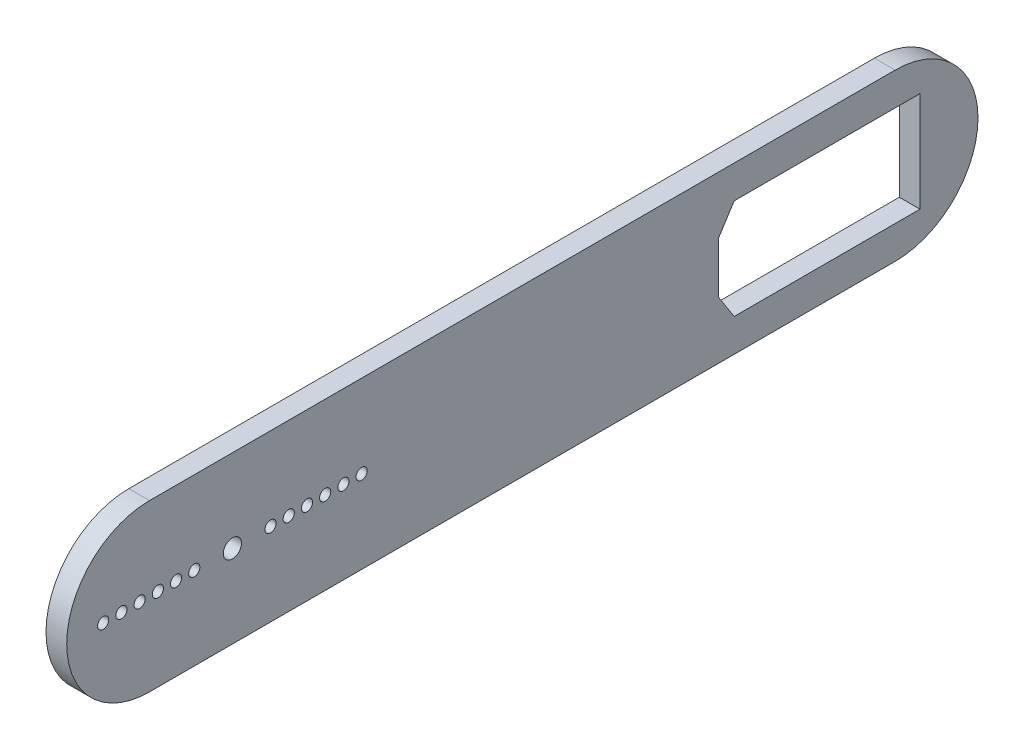
ISO-10303-21;
HEADER;
FILE_DESCRIPTION(('STEP AP214'),'2;1');
FILE_NAME('part.step','',(''),(''),'','','');
FILE_SCHEMA(('AUTOMOTIVE_DESIGN { 1 0 10303 214 1 1 1 1 }'));
ENDSEC;
DATA;
#1=APPLICATION_CONTEXT('core data for automotive mechanical design processes');
#2=APPLICATION_PROTOCOL_DEFINITION('international standard','automotive_design',2000,#1);
#3=PRODUCT_CONTEXT('',#1,'mechanical');
#4=PRODUCT('Part','Part','',(#3));
#5=PRODUCT_RELATED_PRODUCT_CATEGORY('part','',(#4));
#6=PRODUCT_DEFINITION_FORMATION('','',#4);
#7=PRODUCT_DEFINITION_CONTEXT('part definition',#1,'design');
#8=PRODUCT_DEFINITION('design','',#6,#7);
#9=PRODUCT_DEFINITION_SHAPE('','',#8);
#10=(LENGTH_UNIT() NAMED_UNIT(*) SI_UNIT(.MILLI.,.METRE.));
#11=(NAMED_UNIT(*) PLANE_ANGLE_UNIT() SI_UNIT($,.RADIAN.));
#12=(NAMED_UNIT(*) SI_UNIT($,.STERADIAN.) SOLID_ANGLE_UNIT());
#13=UNCERTAINTY_MEASURE_WITH_UNIT(LENGTH_MEASURE(1.E-05),#10,'distance_accuracy_value','');
#14=(GEOMETRIC_REPRESENTATION_CONTEXT(3) GLOBAL_UNCERTAINTY_ASSIGNED_CONTEXT((#13)) GLOBAL_UNIT_ASSIGNED_CONTEXT((#10,
#11,#12)) REPRESENTATION_CONTEXT('',''));
#15=CARTESIAN_POINT('',(0.,0.,0.));
#16=DIRECTION('',(0.,0.,1.));
#17=DIRECTION('',(1.,0.,0.));
#18=AXIS2_PLACEMENT_3D('',#15,#16,#17);
#19=CARTESIAN_POINT('',(-1.25,0.,45.));
#20=DIRECTION('',(-1.,0.,0.));
#21=DIRECTION('',(0.,0.,1.));
#22=AXIS2_PLACEMENT_3D('',#19,#20,#21);
#23=CYLINDRICAL_SURFACE('',#22,10.);
#24=DIRECTION('',(-1.,0.,0.));
#25=VECTOR('',#24,1.);
#26=CARTESIAN_POINT('',(1.25,10.,45.));
#27=LINE('',#26,#25);
#28=CARTESIAN_POINT('',(-1.25,10.,45.));
#29=VERTEX_POINT('',#28);
#30=CARTESIAN_POINT('',(1.25,10.,45.));
#31=VERTEX_POINT('',#30);
#32=EDGE_CURVE('E272',#29,#31,#27,.F.);
#33=ORIENTED_EDGE('',*,*,#32,.F.);
#34=CARTESIAN_POINT('',(-1.25,0.,45.));
#35=DIRECTION('',(-1.,0.,0.));
#36=DIRECTION('',(0.,0.,1.));
#37=AXIS2_PLACEMENT_3D('',#34,#35,#36);
#38=CIRCLE('',#37,10.);
#39=CARTESIAN_POINT('',(-1.25,-10.,45.));
#40=VERTEX_POINT('',#39);
#41=EDGE_CURVE('E45',#40,#29,#38,.T.);
#42=ORIENTED_EDGE('',*,*,#41,.F.);
#43=DIRECTION('',(-1.,0.,0.));
#44=VECTOR('',#43,1.);
#45=CARTESIAN_POINT('',(1.25,-10.,45.));
#46=LINE('',#45,#44);
#47=CARTESIAN_POINT('',(1.25,-10.,45.));
#48=VERTEX_POINT('',#47);
#49=EDGE_CURVE('E275',#48,#40,#46,.T.);
#50=ORIENTED_EDGE('',*,*,#49,.F.);
#51=CARTESIAN_POINT('',(1.25,0.,45.));
#52=DIRECTION('',(-1.,0.,0.));
#53=DIRECTION('',(0.,0.,1.));
#54=AXIS2_PLACEMENT_3D('',#51,#52,#53);
#55=CIRCLE('',#54,10.);
#56=EDGE_CURVE('E11',#31,#48,#55,.F.);
#57=ORIENTED_EDGE('',*,*,#56,.F.);
#58=EDGE_LOOP('',(#33,#42,#50,#57));
#59=FACE_BOUND('',#58,.T.);
#60=ADVANCED_FACE('F37',(#59),#23,.T.);
#61=CARTESIAN_POINT('',(1.25,0.,-45.));
#62=DIRECTION('',(-1.,0.,0.));
#63=DIRECTION('',(0.,0.,1.));
#64=AXIS2_PLACEMENT_3D('',#61,#62,#63);
#65=CYLINDRICAL_SURFACE('',#64,10.);
#66=DIRECTION('',(-1.,0.,0.));
#67=VECTOR('',#66,1.);
#68=CARTESIAN_POINT('',(1.25,10.,-45.));
#69=LINE('',#68,#67);
#70=CARTESIAN_POINT('',(1.25,10.,-45.));
#71=VERTEX_POINT('',#70);
#72=CARTESIAN_POINT('',(-1.25,10.,-45.));
#73=VERTEX_POINT('',#72);
#74=EDGE_CURVE('E258',#71,#73,#69,.T.);
#75=ORIENTED_EDGE('',*,*,#74,.F.);
#76=CARTESIAN_POINT('',(1.25,0.,-45.));
#77=DIRECTION('',(-1.,0.,0.));
#78=DIRECTION('',(0.,0.,1.));
#79=AXIS2_PLACEMENT_3D('',#76,#77,#78);
#80=CIRCLE('',#79,10.);
#81=CARTESIAN_POINT('',(1.25,-10.,-45.));
#82=VERTEX_POINT('',#81);
#83=EDGE_CURVE('E267',#82,#71,#80,.F.);
#84=ORIENTED_EDGE('',*,*,#83,.F.);
#85=DIRECTION('',(-1.,0.,0.));
#86=VECTOR('',#85,1.);
#87=CARTESIAN_POINT('',(1.25,-10.,-45.));
#88=LINE('',#87,#86);
#89=CARTESIAN_POINT('',(-1.25,-10.,-45.));
#90=VERTEX_POINT('',#89);
#91=EDGE_CURVE('E264',#90,#82,#88,.F.);
#92=ORIENTED_EDGE('',*,*,#91,.F.);
#93=CARTESIAN_POINT('',(-1.25,0.,-45.));
#94=DIRECTION('',(-1.,0.,0.));
#95=DIRECTION('',(0.,0.,1.));
#96=AXIS2_PLACEMENT_3D('',#93,#94,#95);
#97=CIRCLE('',#96,10.);
#98=EDGE_CURVE('E269',#73,#90,#97,.T.);
#99=ORIENTED_EDGE('',*,*,#98,.F.);
#100=EDGE_LOOP('',(#75,#84,#92,#99));
#101=FACE_BOUND('',#100,.T.);
#102=ADVANCED_FACE('F285',(#101),#65,.T.);
#103=CARTESIAN_POINT('',(1.25,10.,55.));
#104=DIRECTION('',(0.,-1.,0.));
#105=DIRECTION('',(0.,0.,-1.));
#106=AXIS2_PLACEMENT_3D('',#103,#104,#105);
#107=PLANE('',#106);
#108=DIRECTION('',(0.,0.,1.));
#109=VECTOR('',#108,1.);
#110=CARTESIAN_POINT('',(-1.25,10.,55.));
#111=LINE('',#110,#109);
#112=EDGE_CURVE('E252',#73,#29,#111,.T.);
#113=ORIENTED_EDGE('',*,*,#112,.T.);
#114=ORIENTED_EDGE('',*,*,#32,.T.);
#115=DIRECTION('',(0.,0.,1.));
#116=VECTOR('',#115,1.);
#117=CARTESIAN_POINT('',(1.25,10.,55.));
#118=LINE('',#117,#116);
#119=EDGE_CURVE('E253',#71,#31,#118,.T.);
#120=ORIENTED_EDGE('',*,*,#119,.F.);
#121=ORIENTED_EDGE('',*,*,#74,.T.);
#122=EDGE_LOOP('',(#113,#114,#120,#121));
#123=FACE_BOUND('',#122,.T.);
#124=ADVANCED_FACE('F281',(#123),#107,.F.);
#125=CARTESIAN_POINT('',(1.25,-10.,55.));
#126=DIRECTION('',(0.,1.,0.));
#127=DIRECTION('',(0.,0.,1.));
#128=AXIS2_PLACEMENT_3D('',#125,#126,#127);
#129=PLANE('',#128);
#130=DIRECTION('',(0.,0.,-1.));
#131=VECTOR('',#130,1.);
#132=CARTESIAN_POINT('',(1.25,-10.,55.));
#133=LINE('',#132,#131);
#134=EDGE_CURVE('E255',#48,#82,#133,.T.);
#135=ORIENTED_EDGE('',*,*,#134,.F.);
#136=ORIENTED_EDGE('',*,*,#49,.T.);
#137=DIRECTION('',(0.,0.,-1.));
#138=VECTOR('',#137,1.);
#139=CARTESIAN_POINT('',(-1.25,-10.,55.));
#140=LINE('',#139,#138);
#141=EDGE_CURVE('E256',#40,#90,#140,.T.);
#142=ORIENTED_EDGE('',*,*,#141,.T.);
#143=ORIENTED_EDGE('',*,*,#91,.T.);
#144=EDGE_LOOP('',(#135,#136,#142,#143));
#145=FACE_BOUND('',#144,.T.);
#146=ADVANCED_FACE('F289',(#145),#129,.F.);
#147=CARTESIAN_POINT('',(1.25,0.,0.));
#148=DIRECTION('',(-1.,0.,0.));
#149=DIRECTION('',(0.,0.,1.));
#150=AXIS2_PLACEMENT_3D('',#147,#148,#149);
#151=PLANE('',#150);
#152=DIRECTION('',(0.,0.,1.));
#153=VECTOR('',#152,1.);
#154=CARTESIAN_POINT('',(1.25,-6.04153793456058,0.));
#155=LINE('',#154,#153);
#156=CARTESIAN_POINT('',(1.25,-6.04153793456057,-48.));
#157=VERTEX_POINT('',#156);
#158=CARTESIAN_POINT('',(1.25,-6.04153793456057,-25.5696882340786));
#159=VERTEX_POINT('',#158);
#160=EDGE_CURVE('E149',#157,#159,#155,.T.);
#161=ORIENTED_EDGE('',*,*,#160,.T.);
#162=DIRECTION('',(0.,0.841927198779414,0.539591134059345));
#163=VECTOR('',#162,1.);
#164=CARTESIAN_POINT('',(1.25,9.85717296482707,-15.380204562902));
#165=LINE('',#164,#163);
#166=CARTESIAN_POINT('',(1.25,-3.12608256007548,-23.7011729110215));
#167=VERTEX_POINT('',#166);
#168=EDGE_CURVE('E119',#159,#167,#165,.T.);
#169=ORIENTED_EDGE('',*,*,#168,.T.);
#170=DIRECTION('',(0.,1.,0.));
#171=VECTOR('',#170,1.);
#172=CARTESIAN_POINT('',(1.25,0.,-23.7011729110215));
#173=LINE('',#172,#171);
#174=CARTESIAN_POINT('',(1.25,3.12608256007547,-23.7011729110215));
#175=VERTEX_POINT('',#174);
#176=EDGE_CURVE('E170',#167,#175,#173,.T.);
#177=ORIENTED_EDGE('',*,*,#176,.T.);
#178=DIRECTION('',(0.,0.841927198779414,-0.539591134059345));
#179=VECTOR('',#178,1.);
#180=CARTESIAN_POINT('',(1.25,-9.85717296482707,-15.3802045629021));
#181=LINE('',#180,#179);
#182=CARTESIAN_POINT('',(1.25,6.04153793456057,-25.5696882340786));
#183=VERTEX_POINT('',#182);
#184=EDGE_CURVE('E167',#175,#183,#181,.T.);
#185=ORIENTED_EDGE('',*,*,#184,.T.);
#186=DIRECTION('',(0.,0.,-1.));
#187=VECTOR('',#186,1.);
#188=CARTESIAN_POINT('',(1.25,6.04153793456057,0.));
#189=LINE('',#188,#187);
#190=CARTESIAN_POINT('',(1.25,6.04153793456057,-48.));
#191=VERTEX_POINT('',#190);
#192=EDGE_CURVE('E164',#183,#191,#189,.T.);
#193=ORIENTED_EDGE('',*,*,#192,.T.);
#194=DIRECTION('',(0.,-1.,0.));
#195=VECTOR('',#194,1.);
#196=CARTESIAN_POINT('',(1.25,0.,-48.));
#197=LINE('',#196,#195);
#198=EDGE_CURVE('E161',#191,#157,#197,.T.);
#199=ORIENTED_EDGE('',*,*,#198,.T.);
#200=EDGE_LOOP('',(#161,#169,#177,#185,#193,#199));
#201=FACE_BOUND('',#200,.T.);
#202=CARTESIAN_POINT('',(1.25,0.,50.6));
#203=DIRECTION('',(1.,0.,0.));
#204=DIRECTION('',(0.,0.,-1.));
#205=AXIS2_PLACEMENT_3D('',#202,#203,#204);
#206=CIRCLE('',#205,0.675000000000003);
#207=CARTESIAN_POINT('',(1.25,0.,49.925));
#208=VERTEX_POINT('',#207);
#209=EDGE_CURVE('E179',#208,#208,#206,.T.);
#210=ORIENTED_EDGE('',*,*,#209,.F.);
#211=EDGE_LOOP('',(#210));
#212=FACE_BOUND('',#211,.T.);
#213=CARTESIAN_POINT('',(1.25,0.,48.4));
#214=DIRECTION('',(1.,0.,0.));
#215=DIRECTION('',(0.,0.,-1.));
#216=AXIS2_PLACEMENT_3D('',#213,#214,#215);
#217=CIRCLE('',#216,0.675000000000003);
#218=CARTESIAN_POINT('',(1.25,0.,47.725));
#219=VERTEX_POINT('',#218);
#220=EDGE_CURVE('E185',#219,#219,#217,.T.);
#221=ORIENTED_EDGE('',*,*,#220,.F.);
#222=EDGE_LOOP('',(#221));
#223=FACE_BOUND('',#222,.T.);
#224=CARTESIAN_POINT('',(1.25,0.,46.2));
#225=DIRECTION('',(1.,0.,0.));
#226=DIRECTION('',(0.,0.,-1.));
#227=AXIS2_PLACEMENT_3D('',#224,#225,#226);
#228=CIRCLE('',#227,0.675000000000003);
#229=CARTESIAN_POINT('',(1.25,0.,45.525));
#230=VERTEX_POINT('',#229);
#231=EDGE_CURVE('E191',#230,#230,#228,.T.);
#232=ORIENTED_EDGE('',*,*,#231,.F.);
#233=EDGE_LOOP('',(#232));
#234=FACE_BOUND('',#233,.T.);
#235=CARTESIAN_POINT('',(1.25,0.,44.));
#236=DIRECTION('',(1.,0.,0.));
#237=DIRECTION('',(0.,0.,-1.));
#238=AXIS2_PLACEMENT_3D('',#235,#236,#237);
#239=CIRCLE('',#238,0.675000000000003);
#240=CARTESIAN_POINT('',(1.25,0.,43.325));
#241=VERTEX_POINT('',#240);
#242=EDGE_CURVE('E197',#241,#241,#239,.T.);
#243=ORIENTED_EDGE('',*,*,#242,.F.);
#244=EDGE_LOOP('',(#243));
#245=FACE_BOUND('',#244,.T.);
#246=CARTESIAN_POINT('',(1.25,0.,41.8));
#247=DIRECTION('',(1.,0.,0.));
#248=DIRECTION('',(0.,0.,-1.));
#249=AXIS2_PLACEMENT_3D('',#246,#247,#248);
#250=CIRCLE('',#249,0.675000000000003);
#251=CARTESIAN_POINT('',(1.25,0.,41.125));
#252=VERTEX_POINT('',#251);
#253=EDGE_CURVE('E203',#252,#252,#250,.T.);
#254=ORIENTED_EDGE('',*,*,#253,.F.);
#255=EDGE_LOOP('',(#254));
#256=FACE_BOUND('',#255,.T.);
#257=CARTESIAN_POINT('',(1.25,0.,39.6));
#258=DIRECTION('',(1.,0.,0.));
#259=DIRECTION('',(0.,0.,-1.));
#260=AXIS2_PLACEMENT_3D('',#257,#258,#259);
#261=CIRCLE('',#260,0.675000000000003);
#262=CARTESIAN_POINT('',(1.25,0.,38.925));
#263=VERTEX_POINT('',#262);
#264=EDGE_CURVE('E209',#263,#263,#261,.T.);
#265=ORIENTED_EDGE('',*,*,#264,.F.);
#266=EDGE_LOOP('',(#265));
#267=FACE_BOUND('',#266,.T.);
#268=CARTESIAN_POINT('',(1.25,0.,30.4));
#269=DIRECTION('',(1.,0.,0.));
#270=DIRECTION('',(0.,0.,-1.));
#271=AXIS2_PLACEMENT_3D('',#268,#269,#270);
#272=CIRCLE('',#271,0.675000000000003);
#273=CARTESIAN_POINT('',(1.25,0.,29.725));
#274=VERTEX_POINT('',#273);
#275=EDGE_CURVE('E215',#274,#274,#272,.T.);
#276=ORIENTED_EDGE('',*,*,#275,.F.);
#277=EDGE_LOOP('',(#276));
#278=FACE_BOUND('',#277,.T.);
#279=CARTESIAN_POINT('',(1.25,0.,28.2));
#280=DIRECTION('',(1.,0.,0.));
#281=DIRECTION('',(0.,0.,-1.));
#282=AXIS2_PLACEMENT_3D('',#279,#280,#281);
#283=CIRCLE('',#282,0.675000000000003);
#284=CARTESIAN_POINT('',(1.25,0.,27.525));
#285=VERTEX_POINT('',#284);
#286=EDGE_CURVE('E221',#285,#285,#283,.T.);
#287=ORIENTED_EDGE('',*,*,#286,.F.);
#288=EDGE_LOOP('',(#287));
#289=FACE_BOUND('',#288,.T.);
#290=CARTESIAN_POINT('',(1.25,0.,26.));
#291=DIRECTION('',(1.,0.,0.));
#292=DIRECTION('',(0.,0.,-1.));
#293=AXIS2_PLACEMENT_3D('',#290,#291,#292);
#294=CIRCLE('',#293,0.675000000000003);
#295=CARTESIAN_POINT('',(1.25,0.,25.325));
#296=VERTEX_POINT('',#295);
#297=EDGE_CURVE('E227',#296,#296,#294,.T.);
#298=ORIENTED_EDGE('',*,*,#297,.F.);
#299=EDGE_LOOP('',(#298));
#300=FACE_BOUND('',#299,.T.);
#301=CARTESIAN_POINT('',(1.25,0.,23.8));
#302=DIRECTION('',(1.,0.,0.));
#303=DIRECTION('',(0.,0.,-1.));
#304=AXIS2_PLACEMENT_3D('',#301,#302,#303);
#305=CIRCLE('',#304,0.675000000000003);
#306=CARTESIAN_POINT('',(1.25,0.,23.125));
#307=VERTEX_POINT('',#306);
#308=EDGE_CURVE('E233',#307,#307,#305,.T.);
#309=ORIENTED_EDGE('',*,*,#308,.F.);
#310=EDGE_LOOP('',(#309));
#311=FACE_BOUND('',#310,.T.);
#312=CARTESIAN_POINT('',(1.25,0.,21.6));
#313=DIRECTION('',(1.,0.,0.));
#314=DIRECTION('',(0.,0.,-1.));
#315=AXIS2_PLACEMENT_3D('',#312,#313,#314);
#316=CIRCLE('',#315,0.675000000000003);
#317=CARTESIAN_POINT('',(1.25,0.,20.925));
#318=VERTEX_POINT('',#317);
#319=EDGE_CURVE('E239',#318,#318,#316,.T.);
#320=ORIENTED_EDGE('',*,*,#319,.F.);
#321=EDGE_LOOP('',(#320));
#322=FACE_BOUND('',#321,.T.);
#323=CARTESIAN_POINT('',(1.25,0.,19.4));
#324=DIRECTION('',(1.,0.,0.));
#325=DIRECTION('',(0.,0.,-1.));
#326=AXIS2_PLACEMENT_3D('',#323,#324,#325);
#327=CIRCLE('',#326,0.675000000000003);
#328=CARTESIAN_POINT('',(1.25,0.,18.725));
#329=VERTEX_POINT('',#328);
#330=EDGE_CURVE('E174',#329,#329,#327,.T.);
#331=ORIENTED_EDGE('',*,*,#330,.F.);
#332=EDGE_LOOP('',(#331));
#333=FACE_BOUND('',#332,.T.);
#334=CARTESIAN_POINT('',(1.25,0.,35.));
#335=DIRECTION('',(-1.,0.,0.));
#336=DIRECTION('',(0.,0.,1.));
#337=AXIS2_PLACEMENT_3D('',#334,#335,#336);
#338=CIRCLE('',#337,1.1);
#339=CARTESIAN_POINT('',(1.25,0.,36.1));
#340=VERTEX_POINT('',#339);
#341=EDGE_CURVE('E249',#340,#340,#338,.T.);
#342=ORIENTED_EDGE('',*,*,#341,.T.);
#343=EDGE_LOOP('',(#342));
#344=FACE_BOUND('',#343,.T.);
#345=ORIENTED_EDGE('',*,*,#119,.T.);
#346=ORIENTED_EDGE('',*,*,#56,.T.);
#347=ORIENTED_EDGE('',*,*,#134,.T.);
#348=ORIENTED_EDGE('',*,*,#83,.T.);
#349=EDGE_LOOP('',(#345,#346,#347,#348));
#350=FACE_BOUND('',#349,.T.);
#351=ADVANCED_FACE('F290',(#201,#212,#223,#234,#245,#256,#267,#278,#289,#300,#311,#322,#333,
#344,#350),#151,.F.);
#352=CARTESIAN_POINT('',(-1.25,0.,0.));
#353=DIRECTION('',(-1.,0.,0.));
#354=DIRECTION('',(0.,0.,1.));
#355=AXIS2_PLACEMENT_3D('',#352,#353,#354);
#356=PLANE('',#355);
#357=DIRECTION('',(0.,-0.841927198779414,-0.539591134059345));
#358=VECTOR('',#357,1.);
#359=CARTESIAN_POINT('',(-1.25,-3.12608256007548,-23.7011729110215));
#360=LINE('',#359,#358);
#361=CARTESIAN_POINT('',(-1.25,-3.12608256007548,-23.7011729110215));
#362=VERTEX_POINT('',#361);
#363=CARTESIAN_POINT('',(-1.25,-6.04153793456057,-25.5696882340786));
#364=VERTEX_POINT('',#363);
#365=EDGE_CURVE('E116',#362,#364,#360,.T.);
#366=ORIENTED_EDGE('',*,*,#365,.T.);
#367=DIRECTION('',(0.,0.,-1.));
#368=VECTOR('',#367,1.);
#369=CARTESIAN_POINT('',(-1.25,-6.04153793456057,-25.5696882340786));
#370=LINE('',#369,#368);
#371=CARTESIAN_POINT('',(-1.25,-6.04153793456057,-48.));
#372=VERTEX_POINT('',#371);
#373=EDGE_CURVE('E127',#364,#372,#370,.T.);
#374=ORIENTED_EDGE('',*,*,#373,.T.);
#375=DIRECTION('',(0.,1.,0.));
#376=VECTOR('',#375,1.);
#377=CARTESIAN_POINT('',(-1.25,-6.04153793456057,-48.));
#378=LINE('',#377,#376);
#379=CARTESIAN_POINT('',(-1.25,6.04153793456057,-48.));
#380=VERTEX_POINT('',#379);
#381=EDGE_CURVE('E132',#372,#380,#378,.T.);
#382=ORIENTED_EDGE('',*,*,#381,.T.);
#383=DIRECTION('',(0.,0.,1.));
#384=VECTOR('',#383,1.);
#385=CARTESIAN_POINT('',(-1.25,6.04153793456057,-25.5696882340786));
#386=LINE('',#385,#384);
#387=CARTESIAN_POINT('',(-1.25,6.04153793456057,-25.5696882340786));
#388=VERTEX_POINT('',#387);
#389=EDGE_CURVE('E141',#380,#388,#386,.T.);
#390=ORIENTED_EDGE('',*,*,#389,.T.);
#391=DIRECTION('',(0.,-0.841927198779414,0.539591134059345));
#392=VECTOR('',#391,1.);
#393=CARTESIAN_POINT('',(-1.25,3.12608256007547,-23.7011729110215));
#394=LINE('',#393,#392);
#395=CARTESIAN_POINT('',(-1.25,3.12608256007547,-23.7011729110215));
#396=VERTEX_POINT('',#395);
#397=EDGE_CURVE('E144',#388,#396,#394,.T.);
#398=ORIENTED_EDGE('',*,*,#397,.T.);
#399=DIRECTION('',(0.,-1.,0.));
#400=VECTOR('',#399,1.);
#401=CARTESIAN_POINT('',(-1.25,-3.12608256007548,-23.7011729110215));
#402=LINE('',#401,#400);
#403=EDGE_CURVE('E123',#396,#362,#402,.T.);
#404=ORIENTED_EDGE('',*,*,#403,.T.);
#405=EDGE_LOOP('',(#366,#374,#382,#390,#398,#404));
#406=FACE_BOUND('',#405,.T.);
#407=CARTESIAN_POINT('',(-1.25,0.,50.6));
#408=DIRECTION('',(1.,0.,0.));
#409=DIRECTION('',(0.,0.,-1.));
#410=AXIS2_PLACEMENT_3D('',#407,#408,#409);
#411=CIRCLE('',#410,0.675000000000003);
#412=CARTESIAN_POINT('',(-1.25,0.,49.925));
#413=VERTEX_POINT('',#412);
#414=EDGE_CURVE('E175',#413,#413,#411,.T.);
#415=ORIENTED_EDGE('',*,*,#414,.T.);
#416=EDGE_LOOP('',(#415));
#417=FACE_BOUND('',#416,.T.);
#418=CARTESIAN_POINT('',(-1.25,0.,48.4));
#419=DIRECTION('',(1.,0.,0.));
#420=DIRECTION('',(0.,0.,-1.));
#421=AXIS2_PLACEMENT_3D('',#418,#419,#420);
#422=CIRCLE('',#421,0.675000000000003);
#423=CARTESIAN_POINT('',(-1.25,0.,47.725));
#424=VERTEX_POINT('',#423);
#425=EDGE_CURVE('E182',#424,#424,#422,.T.);
#426=ORIENTED_EDGE('',*,*,#425,.T.);
#427=EDGE_LOOP('',(#426));
#428=FACE_BOUND('',#427,.T.);
#429=CARTESIAN_POINT('',(-1.25,0.,46.2));
#430=DIRECTION('',(1.,0.,0.));
#431=DIRECTION('',(0.,0.,-1.));
#432=AXIS2_PLACEMENT_3D('',#429,#430,#431);
#433=CIRCLE('',#432,0.675000000000003);
#434=CARTESIAN_POINT('',(-1.25,0.,45.525));
#435=VERTEX_POINT('',#434);
#436=EDGE_CURVE('E188',#435,#435,#433,.T.);
#437=ORIENTED_EDGE('',*,*,#436,.T.);
#438=EDGE_LOOP('',(#437));
#439=FACE_BOUND('',#438,.T.);
#440=CARTESIAN_POINT('',(-1.25,0.,44.));
#441=DIRECTION('',(1.,0.,0.));
#442=DIRECTION('',(0.,0.,-1.));
#443=AXIS2_PLACEMENT_3D('',#440,#441,#442);
#444=CIRCLE('',#443,0.675000000000003);
#445=CARTESIAN_POINT('',(-1.25,0.,43.325));
#446=VERTEX_POINT('',#445);
#447=EDGE_CURVE('E194',#446,#446,#444,.T.);
#448=ORIENTED_EDGE('',*,*,#447,.T.);
#449=EDGE_LOOP('',(#448));
#450=FACE_BOUND('',#449,.T.);
#451=CARTESIAN_POINT('',(-1.25,0.,41.8));
#452=DIRECTION('',(1.,0.,0.));
#453=DIRECTION('',(0.,0.,-1.));
#454=AXIS2_PLACEMENT_3D('',#451,#452,#453);
#455=CIRCLE('',#454,0.675000000000003);
#456=CARTESIAN_POINT('',(-1.25,0.,41.125));
#457=VERTEX_POINT('',#456);
#458=EDGE_CURVE('E200',#457,#457,#455,.T.);
#459=ORIENTED_EDGE('',*,*,#458,.T.);
#460=EDGE_LOOP('',(#459));
#461=FACE_BOUND('',#460,.T.);
#462=CARTESIAN_POINT('',(-1.25,0.,39.6));
#463=DIRECTION('',(1.,0.,0.));
#464=DIRECTION('',(0.,0.,-1.));
#465=AXIS2_PLACEMENT_3D('',#462,#463,#464);
#466=CIRCLE('',#465,0.675000000000003);
#467=CARTESIAN_POINT('',(-1.25,0.,38.925));
#468=VERTEX_POINT('',#467);
#469=EDGE_CURVE('E206',#468,#468,#466,.T.);
#470=ORIENTED_EDGE('',*,*,#469,.T.);
#471=EDGE_LOOP('',(#470));
#472=FACE_BOUND('',#471,.T.);
#473=CARTESIAN_POINT('',(-1.25,0.,30.4));
#474=DIRECTION('',(1.,0.,0.));
#475=DIRECTION('',(0.,0.,-1.));
#476=AXIS2_PLACEMENT_3D('',#473,#474,#475);
#477=CIRCLE('',#476,0.675000000000003);
#478=CARTESIAN_POINT('',(-1.25,0.,29.725));
#479=VERTEX_POINT('',#478);
#480=EDGE_CURVE('E212',#479,#479,#477,.T.);
#481=ORIENTED_EDGE('',*,*,#480,.T.);
#482=EDGE_LOOP('',(#481));
#483=FACE_BOUND('',#482,.T.);
#484=CARTESIAN_POINT('',(-1.25,0.,28.2));
#485=DIRECTION('',(1.,0.,0.));
#486=DIRECTION('',(0.,0.,-1.));
#487=AXIS2_PLACEMENT_3D('',#484,#485,#486);
#488=CIRCLE('',#487,0.675000000000003);
#489=CARTESIAN_POINT('',(-1.25,0.,27.525));
#490=VERTEX_POINT('',#489);
#491=EDGE_CURVE('E218',#490,#490,#488,.T.);
#492=ORIENTED_EDGE('',*,*,#491,.T.);
#493=EDGE_LOOP('',(#492));
#494=FACE_BOUND('',#493,.T.);
#495=CARTESIAN_POINT('',(-1.25,0.,26.));
#496=DIRECTION('',(1.,0.,0.));
#497=DIRECTION('',(0.,0.,-1.));
#498=AXIS2_PLACEMENT_3D('',#495,#496,#497);
#499=CIRCLE('',#498,0.675000000000003);
#500=CARTESIAN_POINT('',(-1.25,0.,25.325));
#501=VERTEX_POINT('',#500);
#502=EDGE_CURVE('E224',#501,#501,#499,.T.);
#503=ORIENTED_EDGE('',*,*,#502,.T.);
#504=EDGE_LOOP('',(#503));
#505=FACE_BOUND('',#504,.T.);
#506=CARTESIAN_POINT('',(-1.25,0.,23.8));
#507=DIRECTION('',(1.,0.,0.));
#508=DIRECTION('',(0.,0.,-1.));
#509=AXIS2_PLACEMENT_3D('',#506,#507,#508);
#510=CIRCLE('',#509,0.675000000000003);
#511=CARTESIAN_POINT('',(-1.25,0.,23.125));
#512=VERTEX_POINT('',#511);
#513=EDGE_CURVE('E230',#512,#512,#510,.T.);
#514=ORIENTED_EDGE('',*,*,#513,.T.);
#515=EDGE_LOOP('',(#514));
#516=FACE_BOUND('',#515,.T.);
#517=CARTESIAN_POINT('',(-1.25,0.,21.6));
#518=DIRECTION('',(1.,0.,0.));
#519=DIRECTION('',(0.,0.,-1.));
#520=AXIS2_PLACEMENT_3D('',#517,#518,#519);
#521=CIRCLE('',#520,0.675000000000003);
#522=CARTESIAN_POINT('',(-1.25,0.,20.925));
#523=VERTEX_POINT('',#522);
#524=EDGE_CURVE('E236',#523,#523,#521,.T.);
#525=ORIENTED_EDGE('',*,*,#524,.T.);
#526=EDGE_LOOP('',(#525));
#527=FACE_BOUND('',#526,.T.);
#528=CARTESIAN_POINT('',(-1.25,0.,19.4));
#529=DIRECTION('',(1.,0.,0.));
#530=DIRECTION('',(0.,0.,-1.));
#531=AXIS2_PLACEMENT_3D('',#528,#529,#530);
#532=CIRCLE('',#531,0.675000000000003);
#533=CARTESIAN_POINT('',(-1.25,0.,18.725));
#534=VERTEX_POINT('',#533);
#535=EDGE_CURVE('E242',#534,#534,#532,.T.);
#536=ORIENTED_EDGE('',*,*,#535,.T.);
#537=EDGE_LOOP('',(#536));
#538=FACE_BOUND('',#537,.T.);
#539=CARTESIAN_POINT('',(-1.25,0.,35.));
#540=DIRECTION('',(1.,0.,0.));
#541=DIRECTION('',(0.,0.,-1.));
#542=AXIS2_PLACEMENT_3D('',#539,#540,#541);
#543=CIRCLE('',#542,1.1);
#544=CARTESIAN_POINT('',(-1.25,0.,33.9));
#545=VERTEX_POINT('',#544);
#546=EDGE_CURVE('E178',#545,#545,#543,.T.);
#547=ORIENTED_EDGE('',*,*,#546,.T.);
#548=EDGE_LOOP('',(#547));
#549=FACE_BOUND('',#548,.T.);
#550=ORIENTED_EDGE('',*,*,#141,.F.);
#551=ORIENTED_EDGE('',*,*,#41,.T.);
#552=ORIENTED_EDGE('',*,*,#112,.F.);
#553=ORIENTED_EDGE('',*,*,#98,.T.);
#554=EDGE_LOOP('',(#550,#551,#552,#553));
#555=FACE_BOUND('',#554,.T.);
#556=ADVANCED_FACE('F134',(#406,#417,#428,#439,#450,#461,#472,#483,#494,#505,#516,#527,#538,
#549,#555),#356,.T.);
#557=CARTESIAN_POINT('',(-1.25,0.,35.));
#558=DIRECTION('',(1.,0.,0.));
#559=DIRECTION('',(0.,0.,-1.));
#560=AXIS2_PLACEMENT_3D('',#557,#558,#559);
#561=CYLINDRICAL_SURFACE('',#560,1.1);
#562=ORIENTED_EDGE('',*,*,#546,.F.);
#563=EDGE_LOOP('',(#562));
#564=FACE_BOUND('',#563,.T.);
#565=ORIENTED_EDGE('',*,*,#341,.F.);
#566=EDGE_LOOP('',(#565));
#567=FACE_BOUND('',#566,.T.);
#568=ADVANCED_FACE('F298',(#564,#567),#561,.F.);
#569=CARTESIAN_POINT('',(-1.25,0.,19.4));
#570=DIRECTION('',(1.,0.,0.));
#571=DIRECTION('',(0.,0.,-1.));
#572=AXIS2_PLACEMENT_3D('',#569,#570,#571);
#573=CYLINDRICAL_SURFACE('',#572,0.675000000000003);
#574=ORIENTED_EDGE('',*,*,#535,.F.);
#575=EDGE_LOOP('',(#574));
#576=FACE_BOUND('',#575,.T.);
#577=ORIENTED_EDGE('',*,*,#330,.T.);
#578=EDGE_LOOP('',(#577));
#579=FACE_BOUND('',#578,.T.);
#580=ADVANCED_FACE('F341',(#576,#579),#573,.F.);
#581=CARTESIAN_POINT('',(-1.25,0.,21.6));
#582=DIRECTION('',(1.,0.,0.));
#583=DIRECTION('',(0.,0.,-1.));
#584=AXIS2_PLACEMENT_3D('',#581,#582,#583);
#585=CYLINDRICAL_SURFACE('',#584,0.675000000000003);
#586=ORIENTED_EDGE('',*,*,#524,.F.);
#587=EDGE_LOOP('',(#586));
#588=FACE_BOUND('',#587,.T.);
#589=ORIENTED_EDGE('',*,*,#319,.T.);
#590=EDGE_LOOP('',(#589));
#591=FACE_BOUND('',#590,.T.);
#592=ADVANCED_FACE('F347',(#588,#591),#585,.F.);
#593=CARTESIAN_POINT('',(-1.25,0.,23.8));
#594=DIRECTION('',(1.,0.,0.));
#595=DIRECTION('',(0.,0.,-1.));
#596=AXIS2_PLACEMENT_3D('',#593,#594,#595);
#597=CYLINDRICAL_SURFACE('',#596,0.675000000000003);
#598=ORIENTED_EDGE('',*,*,#513,.F.);
#599=EDGE_LOOP('',(#598));
#600=FACE_BOUND('',#599,.T.);
#601=ORIENTED_EDGE('',*,*,#308,.T.);
#602=EDGE_LOOP('',(#601));
#603=FACE_BOUND('',#602,.T.);
#604=ADVANCED_FACE('F355',(#600,#603),#597,.F.);
#605=CARTESIAN_POINT('',(-1.25,0.,26.));
#606=DIRECTION('',(1.,0.,0.));
#607=DIRECTION('',(0.,0.,-1.));
#608=AXIS2_PLACEMENT_3D('',#605,#606,#607);
#609=CYLINDRICAL_SURFACE('',#608,0.675000000000003);
#610=ORIENTED_EDGE('',*,*,#502,.F.);
#611=EDGE_LOOP('',(#610));
#612=FACE_BOUND('',#611,.T.);
#613=ORIENTED_EDGE('',*,*,#297,.T.);
#614=EDGE_LOOP('',(#613));
#615=FACE_BOUND('',#614,.T.);
#616=ADVANCED_FACE('F363',(#612,#615),#609,.F.);
#617=CARTESIAN_POINT('',(-1.25,0.,28.2));
#618=DIRECTION('',(1.,0.,0.));
#619=DIRECTION('',(0.,0.,-1.));
#620=AXIS2_PLACEMENT_3D('',#617,#618,#619);
#621=CYLINDRICAL_SURFACE('',#620,0.675000000000003);
#622=ORIENTED_EDGE('',*,*,#491,.F.);
#623=EDGE_LOOP('',(#622));
#624=FACE_BOUND('',#623,.T.);
#625=ORIENTED_EDGE('',*,*,#286,.T.);
#626=EDGE_LOOP('',(#625));
#627=FACE_BOUND('',#626,.T.);
#628=ADVANCED_FACE('F371',(#624,#627),#621,.F.);
#629=CARTESIAN_POINT('',(-1.25,0.,30.4));
#630=DIRECTION('',(1.,0.,0.));
#631=DIRECTION('',(0.,0.,-1.));
#632=AXIS2_PLACEMENT_3D('',#629,#630,#631);
#633=CYLINDRICAL_SURFACE('',#632,0.675000000000003);
#634=ORIENTED_EDGE('',*,*,#480,.F.);
#635=EDGE_LOOP('',(#634));
#636=FACE_BOUND('',#635,.T.);
#637=ORIENTED_EDGE('',*,*,#275,.T.);
#638=EDGE_LOOP('',(#637));
#639=FACE_BOUND('',#638,.T.);
#640=ADVANCED_FACE('F379',(#636,#639),#633,.F.);
#641=CARTESIAN_POINT('',(-1.25,0.,39.6));
#642=DIRECTION('',(1.,0.,0.));
#643=DIRECTION('',(0.,0.,-1.));
#644=AXIS2_PLACEMENT_3D('',#641,#642,#643);
#645=CYLINDRICAL_SURFACE('',#644,0.675000000000003);
#646=ORIENTED_EDGE('',*,*,#469,.F.);
#647=EDGE_LOOP('',(#646));
#648=FACE_BOUND('',#647,.T.);
#649=ORIENTED_EDGE('',*,*,#264,.T.);
#650=EDGE_LOOP('',(#649));
#651=FACE_BOUND('',#650,.T.);
#652=ADVANCED_FACE('F387',(#648,#651),#645,.F.);
#653=CARTESIAN_POINT('',(-1.25,0.,41.8));
#654=DIRECTION('',(1.,0.,0.));
#655=DIRECTION('',(0.,0.,-1.));
#656=AXIS2_PLACEMENT_3D('',#653,#654,#655);
#657=CYLINDRICAL_SURFACE('',#656,0.675000000000003);
#658=ORIENTED_EDGE('',*,*,#458,.F.);
#659=EDGE_LOOP('',(#658));
#660=FACE_BOUND('',#659,.T.);
#661=ORIENTED_EDGE('',*,*,#253,.T.);
#662=EDGE_LOOP('',(#661));
#663=FACE_BOUND('',#662,.T.);
#664=ADVANCED_FACE('F395',(#660,#663),#657,.F.);
#665=CARTESIAN_POINT('',(-1.25,0.,44.));
#666=DIRECTION('',(1.,0.,0.));
#667=DIRECTION('',(0.,0.,-1.));
#668=AXIS2_PLACEMENT_3D('',#665,#666,#667);
#669=CYLINDRICAL_SURFACE('',#668,0.675000000000003);
#670=ORIENTED_EDGE('',*,*,#447,.F.);
#671=EDGE_LOOP('',(#670));
#672=FACE_BOUND('',#671,.T.);
#673=ORIENTED_EDGE('',*,*,#242,.T.);
#674=EDGE_LOOP('',(#673));
#675=FACE_BOUND('',#674,.T.);
#676=ADVANCED_FACE('F403',(#672,#675),#669,.F.);
#677=CARTESIAN_POINT('',(-1.25,0.,46.2));
#678=DIRECTION('',(1.,0.,0.));
#679=DIRECTION('',(0.,0.,-1.));
#680=AXIS2_PLACEMENT_3D('',#677,#678,#679);
#681=CYLINDRICAL_SURFACE('',#680,0.675000000000003);
#682=ORIENTED_EDGE('',*,*,#436,.F.);
#683=EDGE_LOOP('',(#682));
#684=FACE_BOUND('',#683,.T.);
#685=ORIENTED_EDGE('',*,*,#231,.T.);
#686=EDGE_LOOP('',(#685));
#687=FACE_BOUND('',#686,.T.);
#688=ADVANCED_FACE('F411',(#684,#687),#681,.F.);
#689=CARTESIAN_POINT('',(-1.25,0.,48.4));
#690=DIRECTION('',(1.,0.,0.));
#691=DIRECTION('',(0.,0.,-1.));
#692=AXIS2_PLACEMENT_3D('',#689,#690,#691);
#693=CYLINDRICAL_SURFACE('',#692,0.675000000000003);
#694=ORIENTED_EDGE('',*,*,#425,.F.);
#695=EDGE_LOOP('',(#694));
#696=FACE_BOUND('',#695,.T.);
#697=ORIENTED_EDGE('',*,*,#220,.T.);
#698=EDGE_LOOP('',(#697));
#699=FACE_BOUND('',#698,.T.);
#700=ADVANCED_FACE('F419',(#696,#699),#693,.F.);
#701=CARTESIAN_POINT('',(-1.25,0.,50.6));
#702=DIRECTION('',(1.,0.,0.));
#703=DIRECTION('',(0.,0.,-1.));
#704=AXIS2_PLACEMENT_3D('',#701,#702,#703);
#705=CYLINDRICAL_SURFACE('',#704,0.675000000000003);
#706=ORIENTED_EDGE('',*,*,#414,.F.);
#707=EDGE_LOOP('',(#706));
#708=FACE_BOUND('',#707,.T.);
#709=ORIENTED_EDGE('',*,*,#209,.T.);
#710=EDGE_LOOP('',(#709));
#711=FACE_BOUND('',#710,.T.);
#712=ADVANCED_FACE('F427',(#708,#711),#705,.F.);
#713=CARTESIAN_POINT('',(-1.25,-3.12608256007548,-23.7011729110215));
#714=DIRECTION('',(0.,-0.539591134059345,0.841927198779414));
#715=DIRECTION('',(0.,-0.841927198779414,-0.539591134059345));
#716=AXIS2_PLACEMENT_3D('',#713,#714,#715);
#717=PLANE('',#716);
#718=DIRECTION('',(1.,0.,0.));
#719=VECTOR('',#718,1.);
#720=CARTESIAN_POINT('',(-1.25,-6.04153793456057,-25.5696882340786));
#721=LINE('',#720,#719);
#722=EDGE_CURVE('E111',#364,#159,#721,.T.);
#723=ORIENTED_EDGE('',*,*,#722,.F.);
#724=ORIENTED_EDGE('',*,*,#365,.F.);
#725=DIRECTION('',(1.,0.,0.));
#726=VECTOR('',#725,1.);
#727=CARTESIAN_POINT('',(-1.25,-3.12608256007548,-23.7011729110215));
#728=LINE('',#727,#726);
#729=EDGE_CURVE('E147',#362,#167,#728,.T.);
#730=ORIENTED_EDGE('',*,*,#729,.T.);
#731=ORIENTED_EDGE('',*,*,#168,.F.);
#732=EDGE_LOOP('',(#723,#724,#730,#731));
#733=FACE_BOUND('',#732,.T.);
#734=ADVANCED_FACE('F113',(#733),#717,.F.);
#735=CARTESIAN_POINT('',(-1.25,-3.12608256007548,-23.7011729110215));
#736=DIRECTION('',(0.,0.,1.));
#737=DIRECTION('',(1.,0.,0.));
#738=AXIS2_PLACEMENT_3D('',#735,#736,#737);
#739=PLANE('',#738);
#740=ORIENTED_EDGE('',*,*,#729,.F.);
#741=ORIENTED_EDGE('',*,*,#403,.F.);
#742=DIRECTION('',(1.,0.,0.));
#743=VECTOR('',#742,1.);
#744=CARTESIAN_POINT('',(-1.25,3.12608256007547,-23.7011729110215));
#745=LINE('',#744,#743);
#746=EDGE_CURVE('E150',#396,#175,#745,.T.);
#747=ORIENTED_EDGE('',*,*,#746,.T.);
#748=ORIENTED_EDGE('',*,*,#176,.F.);
#749=EDGE_LOOP('',(#740,#741,#747,#748));
#750=FACE_BOUND('',#749,.T.);
#751=ADVANCED_FACE('F442',(#750),#739,.F.);
#752=CARTESIAN_POINT('',(-1.25,3.12608256007547,-23.7011729110215));
#753=DIRECTION('',(0.,0.539591134059345,0.841927198779414));
#754=DIRECTION('',(0.,-0.841927198779414,0.539591134059345));
#755=AXIS2_PLACEMENT_3D('',#752,#753,#754);
#756=PLANE('',#755);
#757=ORIENTED_EDGE('',*,*,#746,.F.);
#758=ORIENTED_EDGE('',*,*,#397,.F.);
#759=DIRECTION('',(1.,0.,0.));
#760=VECTOR('',#759,1.);
#761=CARTESIAN_POINT('',(-1.25,6.04153793456057,-25.5696882340786));
#762=LINE('',#761,#760);
#763=EDGE_CURVE('E153',#388,#183,#762,.T.);
#764=ORIENTED_EDGE('',*,*,#763,.T.);
#765=ORIENTED_EDGE('',*,*,#184,.F.);
#766=EDGE_LOOP('',(#757,#758,#764,#765));
#767=FACE_BOUND('',#766,.T.);
#768=ADVANCED_FACE('F449',(#767),#756,.F.);
#769=CARTESIAN_POINT('',(-1.25,6.04153793456057,-25.5696882340786));
#770=DIRECTION('',(0.,1.,0.));
#771=DIRECTION('',(0.,0.,1.));
#772=AXIS2_PLACEMENT_3D('',#769,#770,#771);
#773=PLANE('',#772);
#774=ORIENTED_EDGE('',*,*,#763,.F.);
#775=ORIENTED_EDGE('',*,*,#389,.F.);
#776=DIRECTION('',(1.,0.,0.));
#777=VECTOR('',#776,1.);
#778=CARTESIAN_POINT('',(-1.25,6.04153793456057,-48.));
#779=LINE('',#778,#777);
#780=EDGE_CURVE('E156',#380,#191,#779,.T.);
#781=ORIENTED_EDGE('',*,*,#780,.T.);
#782=ORIENTED_EDGE('',*,*,#192,.F.);
#783=EDGE_LOOP('',(#774,#775,#781,#782));
#784=FACE_BOUND('',#783,.T.);
#785=ADVANCED_FACE('F457',(#784),#773,.F.);
#786=CARTESIAN_POINT('',(-1.25,-6.04153793456057,-48.));
#787=DIRECTION('',(0.,0.,-1.));
#788=DIRECTION('',(-1.,0.,0.));
#789=AXIS2_PLACEMENT_3D('',#786,#787,#788);
#790=PLANE('',#789);
#791=ORIENTED_EDGE('',*,*,#780,.F.);
#792=ORIENTED_EDGE('',*,*,#381,.F.);
#793=DIRECTION('',(1.,0.,0.));
#794=VECTOR('',#793,1.);
#795=CARTESIAN_POINT('',(-1.25,-6.04153793456057,-48.));
#796=LINE('',#795,#794);
#797=EDGE_CURVE('E122',#372,#157,#796,.T.);
#798=ORIENTED_EDGE('',*,*,#797,.T.);
#799=ORIENTED_EDGE('',*,*,#198,.F.);
#800=EDGE_LOOP('',(#791,#792,#798,#799));
#801=FACE_BOUND('',#800,.T.);
#802=ADVANCED_FACE('F465',(#801),#790,.F.);
#803=CARTESIAN_POINT('',(-1.25,-6.04153793456057,-25.5696882340786));
#804=DIRECTION('',(0.,-1.,0.));
#805=DIRECTION('',(0.,0.,-1.));
#806=AXIS2_PLACEMENT_3D('',#803,#804,#805);
#807=PLANE('',#806);
#808=ORIENTED_EDGE('',*,*,#797,.F.);
#809=ORIENTED_EDGE('',*,*,#373,.F.);
#810=ORIENTED_EDGE('',*,*,#722,.T.);
#811=ORIENTED_EDGE('',*,*,#160,.F.);
#812=EDGE_LOOP('',(#808,#809,#810,#811));
#813=FACE_BOUND('',#812,.T.);
#814=ADVANCED_FACE('F128',(#813),#807,.F.);
#815=CLOSED_SHELL('',(#60,#102,#124,#146,#351,#556,#568,#580,#592,#604,#616,#628,#640,#652,#664,
#676,#688,#700,#712,#734,#751,#768,#785,#802,#814));
#816=MANIFOLD_SOLID_BREP('B2',#815);
#817=ADVANCED_BREP_SHAPE_REPRESENTATION('',(#18,#816),#14);
#818=SHAPE_DEFINITION_REPRESENTATION(#9,#817);
ENDSEC;
END-ISO-10303-21;
